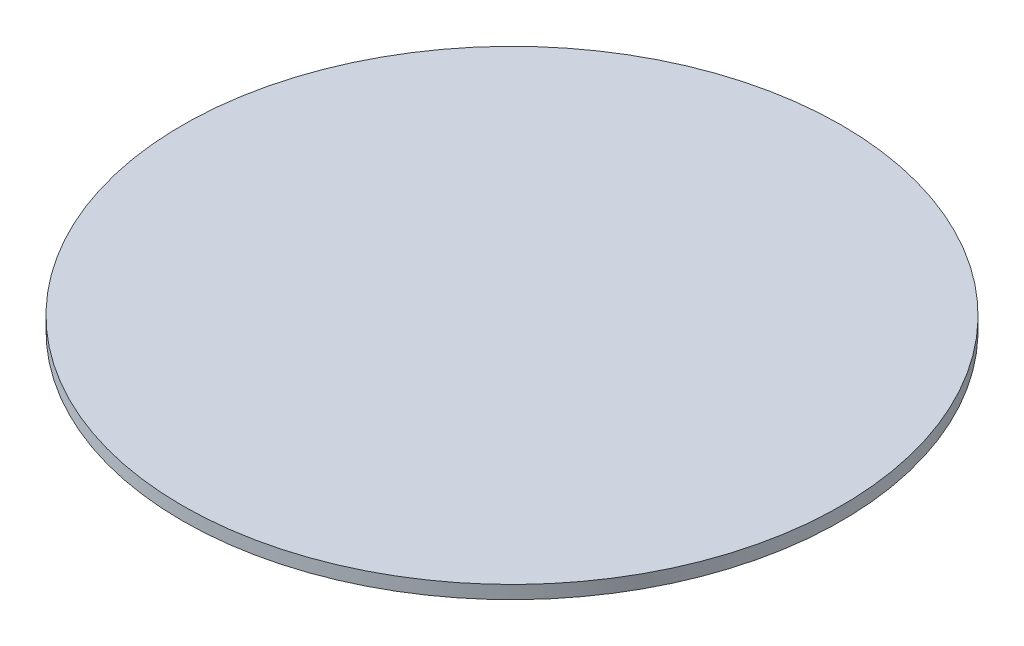
ISO-10303-21;
HEADER;
FILE_DESCRIPTION(('STEP AP214'),'2;1');
FILE_NAME('part.step','',(''),(''),'','','');
FILE_SCHEMA(('AUTOMOTIVE_DESIGN { 1 0 10303 214 1 1 1 1 }'));
ENDSEC;
DATA;
#1=APPLICATION_CONTEXT('core data for automotive mechanical design processes');
#2=APPLICATION_PROTOCOL_DEFINITION('international standard','automotive_design',2000,#1);
#3=PRODUCT_CONTEXT('',#1,'mechanical');
#4=PRODUCT('Part','Part','',(#3));
#5=PRODUCT_RELATED_PRODUCT_CATEGORY('part','',(#4));
#6=PRODUCT_DEFINITION_FORMATION('','',#4);
#7=PRODUCT_DEFINITION_CONTEXT('part definition',#1,'design');
#8=PRODUCT_DEFINITION('design','',#6,#7);
#9=PRODUCT_DEFINITION_SHAPE('','',#8);
#10=(LENGTH_UNIT() NAMED_UNIT(*) SI_UNIT(.MILLI.,.METRE.));
#11=(NAMED_UNIT(*) PLANE_ANGLE_UNIT() SI_UNIT($,.RADIAN.));
#12=(NAMED_UNIT(*) SI_UNIT($,.STERADIAN.) SOLID_ANGLE_UNIT());
#13=UNCERTAINTY_MEASURE_WITH_UNIT(LENGTH_MEASURE(1.E-05),#10,'distance_accuracy_value','');
#14=(GEOMETRIC_REPRESENTATION_CONTEXT(3) GLOBAL_UNCERTAINTY_ASSIGNED_CONTEXT((#13)) GLOBAL_UNIT_ASSIGNED_CONTEXT((#10,
#11,#12)) REPRESENTATION_CONTEXT('',''));
#15=CARTESIAN_POINT('',(0.,0.,0.));
#16=DIRECTION('',(0.,0.,1.));
#17=DIRECTION('',(1.,0.,0.));
#18=AXIS2_PLACEMENT_3D('',#15,#16,#17);
#19=CARTESIAN_POINT('',(0.,3.,0.));
#20=DIRECTION('',(0.,-1.,0.));
#21=DIRECTION('',(0.,0.,-1.));
#22=AXIS2_PLACEMENT_3D('',#19,#20,#21);
#23=CYLINDRICAL_SURFACE('',#22,75.);
#24=CARTESIAN_POINT('',(0.,3.,0.));
#25=DIRECTION('',(0.,1.,0.));
#26=DIRECTION('',(0.,0.,1.));
#27=AXIS2_PLACEMENT_3D('',#24,#25,#26);
#28=CIRCLE('',#27,75.);
#29=CARTESIAN_POINT('',(0.,3.,75.));
#30=VERTEX_POINT('',#29);
#31=EDGE_CURVE('E10',#30,#30,#28,.T.);
#32=ORIENTED_EDGE('',*,*,#31,.F.);
#33=EDGE_LOOP('',(#32));
#34=FACE_BOUND('',#33,.T.);
#35=CARTESIAN_POINT('',(0.,0.,0.));
#36=DIRECTION('',(0.,1.,0.));
#37=DIRECTION('',(0.,0.,1.));
#38=AXIS2_PLACEMENT_3D('',#35,#36,#37);
#39=CIRCLE('',#38,75.);
#40=CARTESIAN_POINT('',(0.,0.,75.));
#41=VERTEX_POINT('',#40);
#42=EDGE_CURVE('E40',#41,#41,#39,.T.);
#43=ORIENTED_EDGE('',*,*,#42,.T.);
#44=EDGE_LOOP('',(#43));
#45=FACE_BOUND('',#44,.T.);
#46=ADVANCED_FACE('F37',(#34,#45),#23,.T.);
#47=CARTESIAN_POINT('',(0.,3.,0.));
#48=DIRECTION('',(0.,1.,0.));
#49=DIRECTION('',(0.,0.,1.));
#50=AXIS2_PLACEMENT_3D('',#47,#48,#49);
#51=PLANE('',#50);
#52=ORIENTED_EDGE('',*,*,#31,.T.);
#53=EDGE_LOOP('',(#52));
#54=FACE_BOUND('',#53,.T.);
#55=ADVANCED_FACE('F52',(#54),#51,.T.);
#56=CARTESIAN_POINT('',(0.,0.,0.));
#57=DIRECTION('',(0.,1.,0.));
#58=DIRECTION('',(0.,0.,1.));
#59=AXIS2_PLACEMENT_3D('',#56,#57,#58);
#60=PLANE('',#59);
#61=ORIENTED_EDGE('',*,*,#42,.F.);
#62=EDGE_LOOP('',(#61));
#63=FACE_BOUND('',#62,.T.);
#64=ADVANCED_FACE('F50',(#63),#60,.F.);
#65=CLOSED_SHELL('',(#46,#55,#64));
#66=MANIFOLD_SOLID_BREP('B2',#65);
#67=ADVANCED_BREP_SHAPE_REPRESENTATION('',(#18,#66),#14);
#68=SHAPE_DEFINITION_REPRESENTATION(#9,#67);
ENDSEC;
END-ISO-10303-21;
